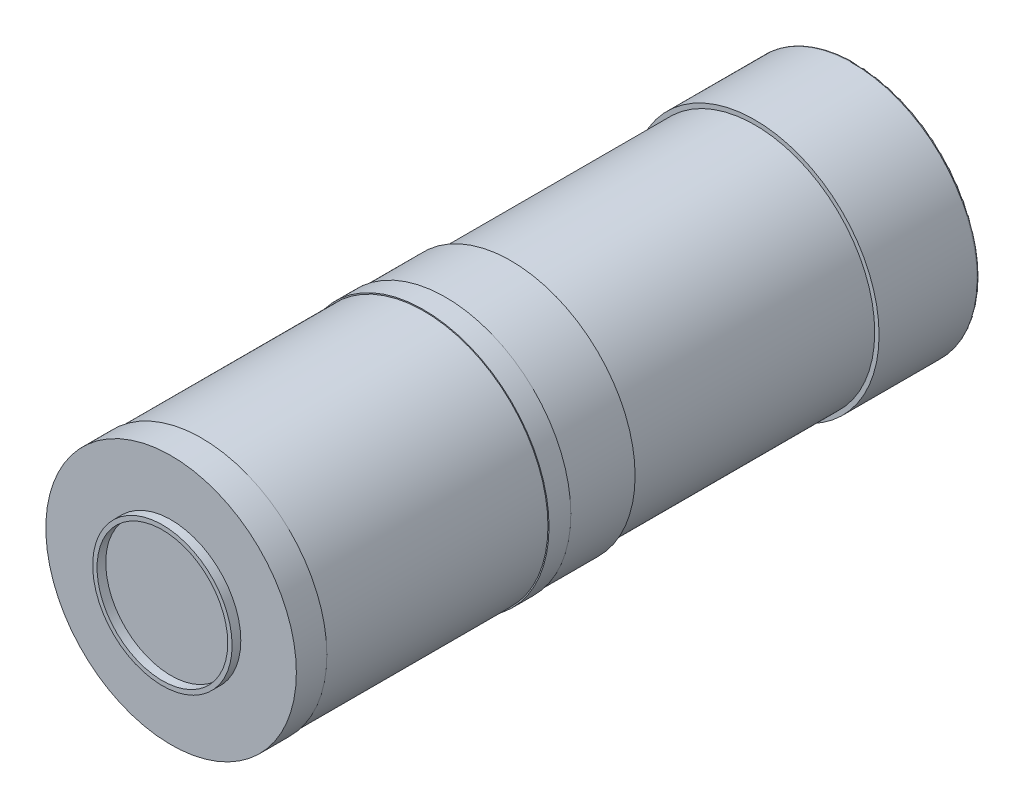
ISO-10303-21;
HEADER;
FILE_DESCRIPTION(('STEP AP214'),'2;1');
FILE_NAME('part.step','',(''),(''),'','','');
FILE_SCHEMA(('AUTOMOTIVE_DESIGN { 1 0 10303 214 1 1 1 1 }'));
ENDSEC;
DATA;
#1=APPLICATION_CONTEXT('core data for automotive mechanical design processes');
#2=APPLICATION_PROTOCOL_DEFINITION('international standard','automotive_design',2000,#1);
#3=PRODUCT_CONTEXT('',#1,'mechanical');
#4=PRODUCT('Part','Part','',(#3));
#5=PRODUCT_RELATED_PRODUCT_CATEGORY('part','',(#4));
#6=PRODUCT_DEFINITION_FORMATION('','',#4);
#7=PRODUCT_DEFINITION_CONTEXT('part definition',#1,'design');
#8=PRODUCT_DEFINITION('design','',#6,#7);
#9=PRODUCT_DEFINITION_SHAPE('','',#8);
#10=(LENGTH_UNIT() NAMED_UNIT(*) SI_UNIT(.MILLI.,.METRE.));
#11=(NAMED_UNIT(*) PLANE_ANGLE_UNIT() SI_UNIT($,.RADIAN.));
#12=(NAMED_UNIT(*) SI_UNIT($,.STERADIAN.) SOLID_ANGLE_UNIT());
#13=UNCERTAINTY_MEASURE_WITH_UNIT(LENGTH_MEASURE(1.E-05),#10,'distance_accuracy_value','');
#14=(GEOMETRIC_REPRESENTATION_CONTEXT(3) GLOBAL_UNCERTAINTY_ASSIGNED_CONTEXT((#13)) GLOBAL_UNIT_ASSIGNED_CONTEXT((#10,
#11,#12)) REPRESENTATION_CONTEXT('',''));
#15=CARTESIAN_POINT('',(0.,0.,0.));
#16=DIRECTION('',(0.,0.,1.));
#17=DIRECTION('',(1.,0.,0.));
#18=AXIS2_PLACEMENT_3D('',#15,#16,#17);
#19=CARTESIAN_POINT('',(0.,0.,23.));
#20=DIRECTION('',(0.,0.,-1.));
#21=DIRECTION('',(-1.,0.,0.));
#22=AXIS2_PLACEMENT_3D('',#19,#20,#21);
#23=CYLINDRICAL_SURFACE('',#22,28.5);
#24=CARTESIAN_POINT('',(0.,0.,0.5));
#25=DIRECTION('',(0.,0.,1.));
#26=DIRECTION('',(1.,0.,0.));
#27=AXIS2_PLACEMENT_3D('',#24,#25,#26);
#28=CIRCLE('',#27,28.5);
#29=CARTESIAN_POINT('',(28.5,0.,0.5));
#30=VERTEX_POINT('',#29);
#31=EDGE_CURVE('E44',#30,#30,#28,.T.);
#32=ORIENTED_EDGE('',*,*,#31,.T.);
#33=EDGE_LOOP('',(#32));
#34=FACE_BOUND('',#33,.T.);
#35=CARTESIAN_POINT('',(0.,0.,23.));
#36=DIRECTION('',(0.,0.,1.));
#37=DIRECTION('',(1.,0.,0.));
#38=AXIS2_PLACEMENT_3D('',#35,#36,#37);
#39=CIRCLE('',#38,28.5);
#40=CARTESIAN_POINT('',(28.5,0.,23.));
#41=VERTEX_POINT('',#40);
#42=EDGE_CURVE('E48',#41,#41,#39,.T.);
#43=ORIENTED_EDGE('',*,*,#42,.F.);
#44=EDGE_LOOP('',(#43));
#45=FACE_BOUND('',#44,.T.);
#46=ADVANCED_FACE('F33',(#34,#45),#23,.T.);
#47=CARTESIAN_POINT('',(0.,0.,23.));
#48=DIRECTION('',(0.,0.,1.));
#49=DIRECTION('',(1.,0.,0.));
#50=AXIS2_PLACEMENT_3D('',#47,#48,#49);
#51=PLANE('',#50);
#52=CARTESIAN_POINT('',(0.,0.,23.));
#53=DIRECTION('',(0.,0.,1.));
#54=DIRECTION('',(1.,0.,0.));
#55=AXIS2_PLACEMENT_3D('',#52,#53,#54);
#56=CIRCLE('',#55,27.5);
#57=CARTESIAN_POINT('',(27.5,0.,23.));
#58=VERTEX_POINT('',#57);
#59=EDGE_CURVE('E54',#58,#58,#56,.T.);
#60=ORIENTED_EDGE('',*,*,#59,.F.);
#61=EDGE_LOOP('',(#60));
#62=FACE_BOUND('',#61,.T.);
#63=ORIENTED_EDGE('',*,*,#42,.T.);
#64=EDGE_LOOP('',(#63));
#65=FACE_BOUND('',#64,.T.);
#66=ADVANCED_FACE('F111',(#62,#65),#51,.T.);
#67=CARTESIAN_POINT('',(0.,0.,0.));
#68=DIRECTION('',(0.,0.,1.));
#69=DIRECTION('',(1.,0.,0.));
#70=AXIS2_PLACEMENT_3D('',#67,#68,#69);
#71=PLANE('',#70);
#72=CARTESIAN_POINT('',(0.,0.,0.));
#73=DIRECTION('',(0.,0.,1.));
#74=DIRECTION('',(1.,0.,0.));
#75=AXIS2_PLACEMENT_3D('',#72,#73,#74);
#76=CIRCLE('',#75,28.);
#77=CARTESIAN_POINT('',(28.,0.,0.));
#78=VERTEX_POINT('',#77);
#79=EDGE_CURVE('E40',#78,#78,#76,.F.);
#80=ORIENTED_EDGE('',*,*,#79,.T.);
#81=EDGE_LOOP('',(#80));
#82=FACE_BOUND('',#81,.T.);
#83=ADVANCED_FACE('F118',(#82),#71,.F.);
#84=CARTESIAN_POINT('',(0.,0.,79.));
#85=DIRECTION('',(0.,0.,-1.));
#86=DIRECTION('',(-1.,0.,0.));
#87=AXIS2_PLACEMENT_3D('',#84,#85,#86);
#88=CYLINDRICAL_SURFACE('',#87,27.5);
#89=CARTESIAN_POINT('',(0.,0.,79.));
#90=DIRECTION('',(0.,0.,1.));
#91=DIRECTION('',(1.,0.,0.));
#92=AXIS2_PLACEMENT_3D('',#89,#90,#91);
#93=CIRCLE('',#92,27.5);
#94=CARTESIAN_POINT('',(27.5,0.,79.));
#95=VERTEX_POINT('',#94);
#96=EDGE_CURVE('E53',#95,#95,#93,.T.);
#97=ORIENTED_EDGE('',*,*,#96,.F.);
#98=EDGE_LOOP('',(#97));
#99=FACE_BOUND('',#98,.T.);
#100=ORIENTED_EDGE('',*,*,#59,.T.);
#101=EDGE_LOOP('',(#100));
#102=FACE_BOUND('',#101,.T.);
#103=ADVANCED_FACE('F123',(#99,#102),#88,.T.);
#104=CARTESIAN_POINT('',(0.,0.,94.));
#105=DIRECTION('',(0.,0.,-1.));
#106=DIRECTION('',(-1.,0.,0.));
#107=AXIS2_PLACEMENT_3D('',#104,#105,#106);
#108=CYLINDRICAL_SURFACE('',#107,28.5);
#109=CARTESIAN_POINT('',(0.,0.,94.));
#110=DIRECTION('',(0.,0.,1.));
#111=DIRECTION('',(1.,0.,0.));
#112=AXIS2_PLACEMENT_3D('',#109,#110,#111);
#113=CIRCLE('',#112,28.5);
#114=CARTESIAN_POINT('',(28.5,0.,94.));
#115=VERTEX_POINT('',#114);
#116=EDGE_CURVE('E57',#115,#115,#113,.T.);
#117=ORIENTED_EDGE('',*,*,#116,.F.);
#118=EDGE_LOOP('',(#117));
#119=FACE_BOUND('',#118,.T.);
#120=CARTESIAN_POINT('',(0.,0.,79.));
#121=DIRECTION('',(0.,0.,1.));
#122=DIRECTION('',(1.,0.,0.));
#123=AXIS2_PLACEMENT_3D('',#120,#121,#122);
#124=CIRCLE('',#123,28.5);
#125=CARTESIAN_POINT('',(28.5,0.,79.));
#126=VERTEX_POINT('',#125);
#127=EDGE_CURVE('E60',#126,#126,#124,.T.);
#128=ORIENTED_EDGE('',*,*,#127,.T.);
#129=EDGE_LOOP('',(#128));
#130=FACE_BOUND('',#129,.T.);
#131=ADVANCED_FACE('F127',(#119,#130),#108,.T.);
#132=CARTESIAN_POINT('',(0.,0.,79.));
#133=DIRECTION('',(0.,0.,1.));
#134=DIRECTION('',(1.,0.,0.));
#135=AXIS2_PLACEMENT_3D('',#132,#133,#134);
#136=PLANE('',#135);
#137=ORIENTED_EDGE('',*,*,#96,.T.);
#138=EDGE_LOOP('',(#137));
#139=FACE_BOUND('',#138,.T.);
#140=ORIENTED_EDGE('',*,*,#127,.F.);
#141=EDGE_LOOP('',(#140));
#142=FACE_BOUND('',#141,.T.);
#143=ADVANCED_FACE('F131',(#139,#142),#136,.F.);
#144=CARTESIAN_POINT('',(0.,0.,99.));
#145=DIRECTION('',(0.,0.,-1.));
#146=DIRECTION('',(-1.,0.,0.));
#147=AXIS2_PLACEMENT_3D('',#144,#145,#146);
#148=CYLINDRICAL_SURFACE('',#147,28.75);
#149=CARTESIAN_POINT('',(0.,0.,99.));
#150=DIRECTION('',(0.,0.,1.));
#151=DIRECTION('',(1.,0.,0.));
#152=AXIS2_PLACEMENT_3D('',#149,#150,#151);
#153=CIRCLE('',#152,28.75);
#154=CARTESIAN_POINT('',(28.75,0.,99.));
#155=VERTEX_POINT('',#154);
#156=EDGE_CURVE('E63',#155,#155,#153,.T.);
#157=ORIENTED_EDGE('',*,*,#156,.F.);
#158=EDGE_LOOP('',(#157));
#159=FACE_BOUND('',#158,.T.);
#160=CARTESIAN_POINT('',(0.,0.,94.));
#161=DIRECTION('',(0.,0.,1.));
#162=DIRECTION('',(1.,0.,0.));
#163=AXIS2_PLACEMENT_3D('',#160,#161,#162);
#164=CIRCLE('',#163,28.75);
#165=CARTESIAN_POINT('',(28.75,0.,94.));
#166=VERTEX_POINT('',#165);
#167=EDGE_CURVE('E66',#166,#166,#164,.T.);
#168=ORIENTED_EDGE('',*,*,#167,.T.);
#169=EDGE_LOOP('',(#168));
#170=FACE_BOUND('',#169,.T.);
#171=ADVANCED_FACE('F135',(#159,#170),#148,.T.);
#172=CARTESIAN_POINT('',(0.,0.,99.));
#173=DIRECTION('',(0.,0.,1.));
#174=DIRECTION('',(1.,0.,0.));
#175=AXIS2_PLACEMENT_3D('',#172,#173,#174);
#176=PLANE('',#175);
#177=CARTESIAN_POINT('',(0.,0.,99.));
#178=DIRECTION('',(0.,0.,1.));
#179=DIRECTION('',(1.,0.,0.));
#180=AXIS2_PLACEMENT_3D('',#177,#178,#179);
#181=CIRCLE('',#180,28.5);
#182=CARTESIAN_POINT('',(28.5,0.,99.));
#183=VERTEX_POINT('',#182);
#184=EDGE_CURVE('E72',#183,#183,#181,.T.);
#185=ORIENTED_EDGE('',*,*,#184,.F.);
#186=EDGE_LOOP('',(#185));
#187=FACE_BOUND('',#186,.T.);
#188=ORIENTED_EDGE('',*,*,#156,.T.);
#189=EDGE_LOOP('',(#188));
#190=FACE_BOUND('',#189,.T.);
#191=ADVANCED_FACE('F139',(#187,#190),#176,.T.);
#192=CARTESIAN_POINT('',(0.,0.,94.));
#193=DIRECTION('',(0.,0.,1.));
#194=DIRECTION('',(1.,0.,0.));
#195=AXIS2_PLACEMENT_3D('',#192,#193,#194);
#196=PLANE('',#195);
#197=ORIENTED_EDGE('',*,*,#116,.T.);
#198=EDGE_LOOP('',(#197));
#199=FACE_BOUND('',#198,.T.);
#200=ORIENTED_EDGE('',*,*,#167,.F.);
#201=EDGE_LOOP('',(#200));
#202=FACE_BOUND('',#201,.T.);
#203=ADVANCED_FACE('F141',(#199,#202),#196,.F.);
#204=CARTESIAN_POINT('',(0.,0.,150.));
#205=DIRECTION('',(0.,0.,-1.));
#206=DIRECTION('',(-1.,0.,0.));
#207=AXIS2_PLACEMENT_3D('',#204,#205,#206);
#208=CYLINDRICAL_SURFACE('',#207,28.5);
#209=CARTESIAN_POINT('',(0.,0.,150.));
#210=DIRECTION('',(0.,0.,1.));
#211=DIRECTION('',(1.,0.,0.));
#212=AXIS2_PLACEMENT_3D('',#209,#210,#211);
#213=CIRCLE('',#212,28.5);
#214=CARTESIAN_POINT('',(28.5,0.,150.));
#215=VERTEX_POINT('',#214);
#216=EDGE_CURVE('E69',#215,#215,#213,.T.);
#217=ORIENTED_EDGE('',*,*,#216,.F.);
#218=EDGE_LOOP('',(#217));
#219=FACE_BOUND('',#218,.T.);
#220=ORIENTED_EDGE('',*,*,#184,.T.);
#221=EDGE_LOOP('',(#220));
#222=FACE_BOUND('',#221,.T.);
#223=ADVANCED_FACE('F144',(#219,#222),#208,.T.);
#224=CARTESIAN_POINT('',(0.,0.,157.));
#225=DIRECTION('',(0.,0.,-1.));
#226=DIRECTION('',(-1.,0.,0.));
#227=AXIS2_PLACEMENT_3D('',#224,#225,#226);
#228=CYLINDRICAL_SURFACE('',#227,28.75);
#229=CARTESIAN_POINT('',(0.,0.,157.));
#230=DIRECTION('',(0.,0.,1.));
#231=DIRECTION('',(1.,0.,0.));
#232=AXIS2_PLACEMENT_3D('',#229,#230,#231);
#233=CIRCLE('',#232,28.75);
#234=CARTESIAN_POINT('',(28.75,0.,157.));
#235=VERTEX_POINT('',#234);
#236=EDGE_CURVE('E75',#235,#235,#233,.T.);
#237=ORIENTED_EDGE('',*,*,#236,.F.);
#238=EDGE_LOOP('',(#237));
#239=FACE_BOUND('',#238,.T.);
#240=CARTESIAN_POINT('',(0.,0.,150.));
#241=DIRECTION('',(0.,0.,1.));
#242=DIRECTION('',(1.,0.,0.));
#243=AXIS2_PLACEMENT_3D('',#240,#241,#242);
#244=CIRCLE('',#243,28.75);
#245=CARTESIAN_POINT('',(28.75,0.,150.));
#246=VERTEX_POINT('',#245);
#247=EDGE_CURVE('E78',#246,#246,#244,.T.);
#248=ORIENTED_EDGE('',*,*,#247,.T.);
#249=EDGE_LOOP('',(#248));
#250=FACE_BOUND('',#249,.T.);
#251=ADVANCED_FACE('F151',(#239,#250),#228,.T.);
#252=CARTESIAN_POINT('',(0.,0.,157.));
#253=DIRECTION('',(0.,0.,1.));
#254=DIRECTION('',(1.,0.,0.));
#255=AXIS2_PLACEMENT_3D('',#252,#253,#254);
#256=PLANE('',#255);
#257=CARTESIAN_POINT('',(0.,0.,157.));
#258=DIRECTION('',(0.,0.,1.));
#259=DIRECTION('',(1.,0.,0.));
#260=AXIS2_PLACEMENT_3D('',#257,#258,#259);
#261=CIRCLE('',#260,16.);
#262=CARTESIAN_POINT('',(16.,0.,157.));
#263=VERTEX_POINT('',#262);
#264=EDGE_CURVE('E84',#263,#263,#261,.T.);
#265=ORIENTED_EDGE('',*,*,#264,.F.);
#266=EDGE_LOOP('',(#265));
#267=FACE_BOUND('',#266,.T.);
#268=ORIENTED_EDGE('',*,*,#236,.T.);
#269=EDGE_LOOP('',(#268));
#270=FACE_BOUND('',#269,.T.);
#271=ADVANCED_FACE('F155',(#267,#270),#256,.T.);
#272=CARTESIAN_POINT('',(0.,0.,150.));
#273=DIRECTION('',(0.,0.,1.));
#274=DIRECTION('',(1.,0.,0.));
#275=AXIS2_PLACEMENT_3D('',#272,#273,#274);
#276=PLANE('',#275);
#277=ORIENTED_EDGE('',*,*,#216,.T.);
#278=EDGE_LOOP('',(#277));
#279=FACE_BOUND('',#278,.T.);
#280=ORIENTED_EDGE('',*,*,#247,.F.);
#281=EDGE_LOOP('',(#280));
#282=FACE_BOUND('',#281,.T.);
#283=ADVANCED_FACE('F107',(#279,#282),#276,.F.);
#284=CARTESIAN_POINT('',(0.,0.,0.5));
#285=DIRECTION('',(0.,0.,1.));
#286=DIRECTION('',(1.,0.,0.));
#287=AXIS2_PLACEMENT_3D('',#284,#285,#286);
#288=TOROIDAL_SURFACE('',#287,28.,0.5);
#289=ORIENTED_EDGE('',*,*,#79,.F.);
#290=EDGE_LOOP('',(#289));
#291=FACE_BOUND('',#290,.T.);
#292=ORIENTED_EDGE('',*,*,#31,.F.);
#293=EDGE_LOOP('',(#292));
#294=FACE_BOUND('',#293,.T.);
#295=ADVANCED_FACE('F35',(#291,#294),#288,.T.);
#296=CARTESIAN_POINT('',(0.,0.,159.));
#297=DIRECTION('',(0.,0.,1.));
#298=DIRECTION('',(1.,0.,0.));
#299=AXIS2_PLACEMENT_3D('',#296,#297,#298);
#300=PLANE('',#299);
#301=CARTESIAN_POINT('',(0.,0.,159.));
#302=DIRECTION('',(0.,0.,1.));
#303=DIRECTION('',(1.,0.,0.));
#304=AXIS2_PLACEMENT_3D('',#301,#302,#303);
#305=CIRCLE('',#304,16.);
#306=CARTESIAN_POINT('',(16.,0.,159.));
#307=VERTEX_POINT('',#306);
#308=EDGE_CURVE('E81',#307,#307,#305,.T.);
#309=ORIENTED_EDGE('',*,*,#308,.T.);
#310=EDGE_LOOP('',(#309));
#311=FACE_BOUND('',#310,.T.);
#312=CARTESIAN_POINT('',(0.,0.,159.));
#313=DIRECTION('',(0.,0.,1.));
#314=DIRECTION('',(1.,0.,0.));
#315=AXIS2_PLACEMENT_3D('',#312,#313,#314);
#316=CIRCLE('',#315,15.);
#317=CARTESIAN_POINT('',(15.,0.,159.));
#318=VERTEX_POINT('',#317);
#319=EDGE_CURVE('E87',#318,#318,#316,.T.);
#320=ORIENTED_EDGE('',*,*,#319,.F.);
#321=EDGE_LOOP('',(#320));
#322=FACE_BOUND('',#321,.T.);
#323=ADVANCED_FACE('F95',(#311,#322),#300,.T.);
#324=CARTESIAN_POINT('',(0.,0.,159.));
#325=DIRECTION('',(0.,0.,-1.));
#326=DIRECTION('',(-1.,0.,0.));
#327=AXIS2_PLACEMENT_3D('',#324,#325,#326);
#328=CYLINDRICAL_SURFACE('',#327,16.);
#329=ORIENTED_EDGE('',*,*,#308,.F.);
#330=EDGE_LOOP('',(#329));
#331=FACE_BOUND('',#330,.T.);
#332=ORIENTED_EDGE('',*,*,#264,.T.);
#333=EDGE_LOOP('',(#332));
#334=FACE_BOUND('',#333,.T.);
#335=ADVANCED_FACE('F97',(#331,#334),#328,.T.);
#336=CARTESIAN_POINT('',(0.,0.,159.));
#337=DIRECTION('',(0.,0.,-1.));
#338=DIRECTION('',(-1.,0.,0.));
#339=AXIS2_PLACEMENT_3D('',#336,#337,#338);
#340=CYLINDRICAL_SURFACE('',#339,15.);
#341=ORIENTED_EDGE('',*,*,#319,.T.);
#342=EDGE_LOOP('',(#341));
#343=FACE_BOUND('',#342,.T.);
#344=CARTESIAN_POINT('',(0.,0.,157.));
#345=DIRECTION('',(0.,0.,1.));
#346=DIRECTION('',(1.,0.,0.));
#347=AXIS2_PLACEMENT_3D('',#344,#345,#346);
#348=CIRCLE('',#347,15.);
#349=CARTESIAN_POINT('',(15.,0.,157.));
#350=VERTEX_POINT('',#349);
#351=EDGE_CURVE('E10',#350,#350,#348,.F.);
#352=ORIENTED_EDGE('',*,*,#351,.T.);
#353=EDGE_LOOP('',(#352));
#354=FACE_BOUND('',#353,.T.);
#355=ADVANCED_FACE('F93',(#343,#354),#340,.F.);
#356=ORIENTED_EDGE('',*,*,#351,.F.);
#357=EDGE_LOOP('',(#356));
#358=FACE_BOUND('',#357,.T.);
#359=ADVANCED_FACE('F162',(#358),#256,.T.);
#360=CLOSED_SHELL('',(#46,#66,#83,#103,#131,#143,#171,#191,#203,#223,#251,#271,#283,#295,#323,
#335,#355,#359));
#361=MANIFOLD_SOLID_BREP('B2',#360);
#362=ADVANCED_BREP_SHAPE_REPRESENTATION('',(#18,#361),#14);
#363=SHAPE_DEFINITION_REPRESENTATION(#9,#362);
ENDSEC;
END-ISO-10303-21;
